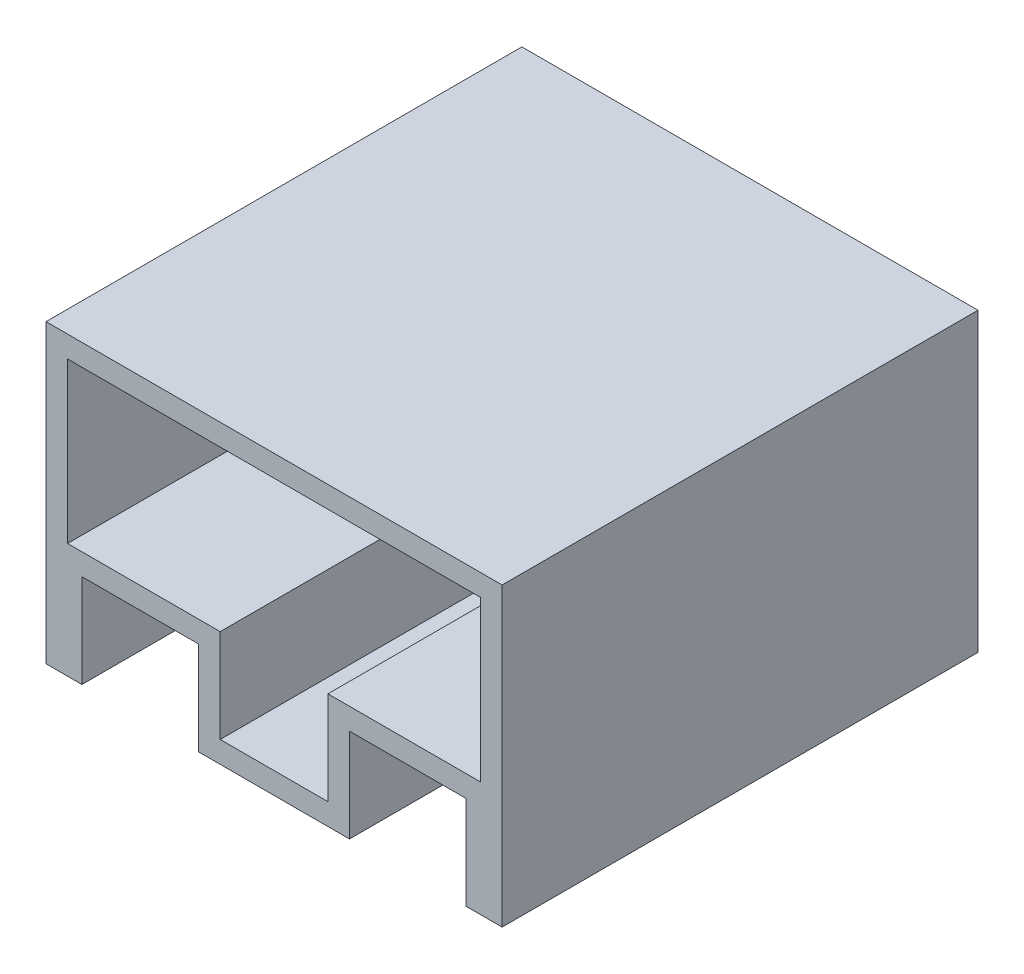
ISO-10303-21;
HEADER;
FILE_DESCRIPTION(('STEP AP214'),'2;1');
FILE_NAME('part.step','',(''),(''),'','','');
FILE_SCHEMA(('AUTOMOTIVE_DESIGN { 1 0 10303 214 1 1 1 1 }'));
ENDSEC;
DATA;
#1=APPLICATION_CONTEXT('core data for automotive mechanical design processes');
#2=APPLICATION_PROTOCOL_DEFINITION('international standard','automotive_design',2000,#1);
#3=PRODUCT_CONTEXT('',#1,'mechanical');
#4=PRODUCT('Part','Part','',(#3));
#5=PRODUCT_RELATED_PRODUCT_CATEGORY('part','',(#4));
#6=PRODUCT_DEFINITION_FORMATION('','',#4);
#7=PRODUCT_DEFINITION_CONTEXT('part definition',#1,'design');
#8=PRODUCT_DEFINITION('design','',#6,#7);
#9=PRODUCT_DEFINITION_SHAPE('','',#8);
#10=(LENGTH_UNIT() NAMED_UNIT(*) SI_UNIT(.MILLI.,.METRE.));
#11=(NAMED_UNIT(*) PLANE_ANGLE_UNIT() SI_UNIT($,.RADIAN.));
#12=(NAMED_UNIT(*) SI_UNIT($,.STERADIAN.) SOLID_ANGLE_UNIT());
#13=UNCERTAINTY_MEASURE_WITH_UNIT(LENGTH_MEASURE(1.E-05),#10,'distance_accuracy_value','');
#14=(GEOMETRIC_REPRESENTATION_CONTEXT(3) GLOBAL_UNCERTAINTY_ASSIGNED_CONTEXT((#13)) GLOBAL_UNIT_ASSIGNED_CONTEXT((#10,
#11,#12)) REPRESENTATION_CONTEXT('',''));
#15=CARTESIAN_POINT('',(0.,0.,0.));
#16=DIRECTION('',(0.,0.,1.));
#17=DIRECTION('',(1.,0.,0.));
#18=AXIS2_PLACEMENT_3D('',#15,#16,#17);
#19=CARTESIAN_POINT('',(15.7,-10.1,26.5));
#20=DIRECTION('',(0.,1.,0.));
#21=DIRECTION('',(0.,0.,1.));
#22=AXIS2_PLACEMENT_3D('',#19,#20,#21);
#23=PLANE('',#22);
#24=DIRECTION('',(0.,0.,-1.));
#25=VECTOR('',#24,1.);
#26=CARTESIAN_POINT('',(22.2,-10.1,26.5));
#27=LINE('',#26,#25);
#28=CARTESIAN_POINT('',(22.2,-10.1,26.5));
#29=VERTEX_POINT('',#28);
#30=CARTESIAN_POINT('',(22.2,-10.1,0.));
#31=VERTEX_POINT('',#30);
#32=EDGE_CURVE('E196',#29,#31,#27,.T.);
#33=ORIENTED_EDGE('',*,*,#32,.F.);
#34=DIRECTION('',(1.,0.,0.));
#35=VECTOR('',#34,1.);
#36=CARTESIAN_POINT('',(15.7,-10.1,26.5));
#37=LINE('',#36,#35);
#38=CARTESIAN_POINT('',(15.7,-10.1,26.5));
#39=VERTEX_POINT('',#38);
#40=EDGE_CURVE('E180',#39,#29,#37,.T.);
#41=ORIENTED_EDGE('',*,*,#40,.F.);
#42=DIRECTION('',(0.,0.,-1.));
#43=VECTOR('',#42,1.);
#44=CARTESIAN_POINT('',(15.7,-10.1,26.5));
#45=LINE('',#44,#43);
#46=CARTESIAN_POINT('',(15.7,-10.1,0.));
#47=VERTEX_POINT('',#46);
#48=EDGE_CURVE('E311',#39,#47,#45,.T.);
#49=ORIENTED_EDGE('',*,*,#48,.T.);
#50=DIRECTION('',(1.,0.,0.));
#51=VECTOR('',#50,1.);
#52=CARTESIAN_POINT('',(15.7,-10.1,0.));
#53=LINE('',#52,#51);
#54=EDGE_CURVE('E302',#47,#31,#53,.T.);
#55=ORIENTED_EDGE('',*,*,#54,.T.);
#56=EDGE_LOOP('',(#33,#41,#49,#55));
#57=FACE_BOUND('',#56,.T.);
#58=ADVANCED_FACE('F33',(#57),#23,.F.);
#59=CARTESIAN_POINT('',(-1.2,-10.1,26.5));
#60=DIRECTION('',(0.,1.,0.));
#61=DIRECTION('',(0.,0.,1.));
#62=AXIS2_PLACEMENT_3D('',#59,#60,#61);
#63=PLANE('',#62);
#64=DIRECTION('',(0.,0.,1.));
#65=VECTOR('',#64,1.);
#66=CARTESIAN_POINT('',(0.800000000000002,-10.1,26.5));
#67=LINE('',#66,#65);
#68=CARTESIAN_POINT('',(0.800000000000004,-10.1,0.));
#69=VERTEX_POINT('',#68);
#70=CARTESIAN_POINT('',(0.800000000000002,-10.1,26.5));
#71=VERTEX_POINT('',#70);
#72=EDGE_CURVE('E206',#69,#71,#67,.T.);
#73=ORIENTED_EDGE('',*,*,#72,.F.);
#74=DIRECTION('',(1.,0.,0.));
#75=VECTOR('',#74,1.);
#76=CARTESIAN_POINT('',(-1.2,-10.1,0.));
#77=LINE('',#76,#75);
#78=CARTESIAN_POINT('',(7.3,-10.1,0.));
#79=VERTEX_POINT('',#78);
#80=EDGE_CURVE('E294',#69,#79,#77,.T.);
#81=ORIENTED_EDGE('',*,*,#80,.T.);
#82=DIRECTION('',(0.,0.,-1.));
#83=VECTOR('',#82,1.);
#84=CARTESIAN_POINT('',(7.3,-10.1,26.5));
#85=LINE('',#84,#83);
#86=CARTESIAN_POINT('',(7.3,-10.1,26.5));
#87=VERTEX_POINT('',#86);
#88=EDGE_CURVE('E11',#87,#79,#85,.T.);
#89=ORIENTED_EDGE('',*,*,#88,.F.);
#90=DIRECTION('',(1.,0.,0.));
#91=VECTOR('',#90,1.);
#92=CARTESIAN_POINT('',(-1.2,-10.1,26.5));
#93=LINE('',#92,#91);
#94=EDGE_CURVE('E281',#71,#87,#93,.T.);
#95=ORIENTED_EDGE('',*,*,#94,.F.);
#96=EDGE_LOOP('',(#73,#81,#89,#95));
#97=FACE_BOUND('',#96,.T.);
#98=ADVANCED_FACE('F345',(#97),#63,.F.);
#99=CARTESIAN_POINT('',(0.,0.,26.5));
#100=DIRECTION('',(0.,0.,1.));
#101=DIRECTION('',(1.,0.,0.));
#102=AXIS2_PLACEMENT_3D('',#99,#100,#101);
#103=PLANE('',#102);
#104=DIRECTION('',(0.,-1.,0.));
#105=VECTOR('',#104,1.);
#106=CARTESIAN_POINT('',(-1.2,1.2,26.5));
#107=LINE('',#106,#105);
#108=CARTESIAN_POINT('',(-1.2,1.2,26.5));
#109=VERTEX_POINT('',#108);
#110=CARTESIAN_POINT('',(-1.2,-15.3,26.5));
#111=VERTEX_POINT('',#110);
#112=EDGE_CURVE('E279',#109,#111,#107,.T.);
#113=ORIENTED_EDGE('',*,*,#112,.T.);
#114=DIRECTION('',(-1.,0.,0.));
#115=VECTOR('',#114,1.);
#116=CARTESIAN_POINT('',(-1.2,-15.3,26.5));
#117=LINE('',#116,#115);
#118=CARTESIAN_POINT('',(0.800000000000002,-15.3,26.5));
#119=VERTEX_POINT('',#118);
#120=EDGE_CURVE('E214',#119,#111,#117,.T.);
#121=ORIENTED_EDGE('',*,*,#120,.F.);
#122=DIRECTION('',(0.,1.,0.));
#123=VECTOR('',#122,1.);
#124=CARTESIAN_POINT('',(0.800000000000002,-15.3,26.5));
#125=LINE('',#124,#123);
#126=EDGE_CURVE('E48',#119,#71,#125,.T.);
#127=ORIENTED_EDGE('',*,*,#126,.T.);
#128=ORIENTED_EDGE('',*,*,#94,.T.);
#129=DIRECTION('',(0.,-1.,0.));
#130=VECTOR('',#129,1.);
#131=CARTESIAN_POINT('',(7.3,-10.1,26.5));
#132=LINE('',#131,#130);
#133=CARTESIAN_POINT('',(7.3,-15.3,26.5));
#134=VERTEX_POINT('',#133);
#135=EDGE_CURVE('E284',#87,#134,#132,.T.);
#136=ORIENTED_EDGE('',*,*,#135,.T.);
#137=DIRECTION('',(1.,0.,0.));
#138=VECTOR('',#137,1.);
#139=CARTESIAN_POINT('',(7.3,-15.3,26.5));
#140=LINE('',#139,#138);
#141=CARTESIAN_POINT('',(15.7,-15.3,26.5));
#142=VERTEX_POINT('',#141);
#143=EDGE_CURVE('E286',#134,#142,#140,.T.);
#144=ORIENTED_EDGE('',*,*,#143,.T.);
#145=DIRECTION('',(0.,1.,0.));
#146=VECTOR('',#145,1.);
#147=CARTESIAN_POINT('',(15.7,-15.3,26.5));
#148=LINE('',#147,#146);
#149=EDGE_CURVE('E288',#142,#39,#148,.T.);
#150=ORIENTED_EDGE('',*,*,#149,.T.);
#151=ORIENTED_EDGE('',*,*,#40,.T.);
#152=DIRECTION('',(0.,1.,0.));
#153=VECTOR('',#152,1.);
#154=CARTESIAN_POINT('',(22.2,-15.3,26.5));
#155=LINE('',#154,#153);
#156=CARTESIAN_POINT('',(22.2,-15.3,26.5));
#157=VERTEX_POINT('',#156);
#158=EDGE_CURVE('E187',#157,#29,#155,.T.);
#159=ORIENTED_EDGE('',*,*,#158,.F.);
#160=DIRECTION('',(-1.,0.,0.));
#161=VECTOR('',#160,1.);
#162=CARTESIAN_POINT('',(24.2,-15.3,26.5));
#163=LINE('',#162,#161);
#164=CARTESIAN_POINT('',(24.2,-15.3,26.5));
#165=VERTEX_POINT('',#164);
#166=EDGE_CURVE('E183',#165,#157,#163,.T.);
#167=ORIENTED_EDGE('',*,*,#166,.F.);
#168=DIRECTION('',(0.,1.,0.));
#169=VECTOR('',#168,1.);
#170=CARTESIAN_POINT('',(24.2,1.2,26.5));
#171=LINE('',#170,#169);
#172=CARTESIAN_POINT('',(24.2,1.2,26.5));
#173=VERTEX_POINT('',#172);
#174=EDGE_CURVE('E171',#165,#173,#171,.T.);
#175=ORIENTED_EDGE('',*,*,#174,.T.);
#176=DIRECTION('',(-1.,0.,0.));
#177=VECTOR('',#176,1.);
#178=CARTESIAN_POINT('',(-1.2,1.2,26.5));
#179=LINE('',#178,#177);
#180=EDGE_CURVE('E179',#173,#109,#179,.T.);
#181=ORIENTED_EDGE('',*,*,#180,.T.);
#182=EDGE_LOOP('',(#113,#121,#127,#128,#136,#144,#150,#151,#159,#167,#175,#181));
#183=FACE_BOUND('',#182,.T.);
#184=DIRECTION('',(1.,0.,0.));
#185=VECTOR('',#184,1.);
#186=CARTESIAN_POINT('',(0.,-8.9,26.5));
#187=LINE('',#186,#185);
#188=CARTESIAN_POINT('',(0.,-8.9,26.5));
#189=VERTEX_POINT('',#188);
#190=CARTESIAN_POINT('',(8.5,-8.9,26.5));
#191=VERTEX_POINT('',#190);
#192=EDGE_CURVE('E224',#189,#191,#187,.T.);
#193=ORIENTED_EDGE('',*,*,#192,.F.);
#194=DIRECTION('',(0.,-1.,0.));
#195=VECTOR('',#194,1.);
#196=CARTESIAN_POINT('',(0.,0.,26.5));
#197=LINE('',#196,#195);
#198=CARTESIAN_POINT('',(0.,0.,26.5));
#199=VERTEX_POINT('',#198);
#200=EDGE_CURVE('E222',#199,#189,#197,.T.);
#201=ORIENTED_EDGE('',*,*,#200,.F.);
#202=DIRECTION('',(-1.,0.,0.));
#203=VECTOR('',#202,1.);
#204=CARTESIAN_POINT('',(0.,0.,26.5));
#205=LINE('',#204,#203);
#206=CARTESIAN_POINT('',(23.,0.,26.5));
#207=VERTEX_POINT('',#206);
#208=EDGE_CURVE('E237',#207,#199,#205,.T.);
#209=ORIENTED_EDGE('',*,*,#208,.F.);
#210=DIRECTION('',(0.,1.,0.));
#211=VECTOR('',#210,1.);
#212=CARTESIAN_POINT('',(23.,0.,26.5));
#213=LINE('',#212,#211);
#214=CARTESIAN_POINT('',(23.,-8.9,26.5));
#215=VERTEX_POINT('',#214);
#216=EDGE_CURVE('E235',#215,#207,#213,.T.);
#217=ORIENTED_EDGE('',*,*,#216,.F.);
#218=DIRECTION('',(1.,0.,0.));
#219=VECTOR('',#218,1.);
#220=CARTESIAN_POINT('',(14.5,-8.9,26.5));
#221=LINE('',#220,#219);
#222=CARTESIAN_POINT('',(14.5,-8.9,26.5));
#223=VERTEX_POINT('',#222);
#224=EDGE_CURVE('E233',#223,#215,#221,.T.);
#225=ORIENTED_EDGE('',*,*,#224,.F.);
#226=DIRECTION('',(0.,1.,0.));
#227=VECTOR('',#226,1.);
#228=CARTESIAN_POINT('',(14.5,-14.1,26.5));
#229=LINE('',#228,#227);
#230=CARTESIAN_POINT('',(14.5,-14.1,26.5));
#231=VERTEX_POINT('',#230);
#232=EDGE_CURVE('E231',#231,#223,#229,.T.);
#233=ORIENTED_EDGE('',*,*,#232,.F.);
#234=DIRECTION('',(1.,0.,0.));
#235=VECTOR('',#234,1.);
#236=CARTESIAN_POINT('',(8.5,-14.1,26.5));
#237=LINE('',#236,#235);
#238=CARTESIAN_POINT('',(8.5,-14.1,26.5));
#239=VERTEX_POINT('',#238);
#240=EDGE_CURVE('E229',#239,#231,#237,.T.);
#241=ORIENTED_EDGE('',*,*,#240,.F.);
#242=DIRECTION('',(0.,-1.,0.));
#243=VECTOR('',#242,1.);
#244=CARTESIAN_POINT('',(8.5,-8.9,26.5));
#245=LINE('',#244,#243);
#246=EDGE_CURVE('E227',#191,#239,#245,.T.);
#247=ORIENTED_EDGE('',*,*,#246,.F.);
#248=EDGE_LOOP('',(#193,#201,#209,#217,#225,#233,#241,#247));
#249=FACE_BOUND('',#248,.T.);
#250=ADVANCED_FACE('F184',(#183,#249),#103,.T.);
#251=CARTESIAN_POINT('',(0.,0.,0.));
#252=DIRECTION('',(0.,0.,1.));
#253=DIRECTION('',(1.,0.,0.));
#254=AXIS2_PLACEMENT_3D('',#251,#252,#253);
#255=PLANE('',#254);
#256=DIRECTION('',(0.,-1.,0.));
#257=VECTOR('',#256,1.);
#258=CARTESIAN_POINT('',(-1.2,1.2,0.));
#259=LINE('',#258,#257);
#260=CARTESIAN_POINT('',(-1.2,1.2,0.));
#261=VERTEX_POINT('',#260);
#262=CARTESIAN_POINT('',(-1.2,-15.3,0.));
#263=VERTEX_POINT('',#262);
#264=EDGE_CURVE('E278',#261,#263,#259,.T.);
#265=ORIENTED_EDGE('',*,*,#264,.F.);
#266=DIRECTION('',(-1.,0.,0.));
#267=VECTOR('',#266,1.);
#268=CARTESIAN_POINT('',(-1.2,1.2,0.));
#269=LINE('',#268,#267);
#270=CARTESIAN_POINT('',(24.2,1.2,0.));
#271=VERTEX_POINT('',#270);
#272=EDGE_CURVE('E282',#271,#261,#269,.T.);
#273=ORIENTED_EDGE('',*,*,#272,.F.);
#274=DIRECTION('',(0.,1.,0.));
#275=VECTOR('',#274,1.);
#276=CARTESIAN_POINT('',(24.2,1.2,0.));
#277=LINE('',#276,#275);
#278=CARTESIAN_POINT('',(24.2,-15.3,0.));
#279=VERTEX_POINT('',#278);
#280=EDGE_CURVE('E305',#279,#271,#277,.T.);
#281=ORIENTED_EDGE('',*,*,#280,.F.);
#282=DIRECTION('',(1.,0.,0.));
#283=VECTOR('',#282,1.);
#284=CARTESIAN_POINT('',(24.2,-15.3,0.));
#285=LINE('',#284,#283);
#286=CARTESIAN_POINT('',(22.2,-15.3,0.));
#287=VERTEX_POINT('',#286);
#288=EDGE_CURVE('E195',#287,#279,#285,.T.);
#289=ORIENTED_EDGE('',*,*,#288,.F.);
#290=DIRECTION('',(0.,1.,0.));
#291=VECTOR('',#290,1.);
#292=CARTESIAN_POINT('',(22.2,-15.3,0.));
#293=LINE('',#292,#291);
#294=EDGE_CURVE('E201',#287,#31,#293,.T.);
#295=ORIENTED_EDGE('',*,*,#294,.T.);
#296=ORIENTED_EDGE('',*,*,#54,.F.);
#297=DIRECTION('',(0.,1.,0.));
#298=VECTOR('',#297,1.);
#299=CARTESIAN_POINT('',(15.7,-15.3,0.));
#300=LINE('',#299,#298);
#301=CARTESIAN_POINT('',(15.7,-15.3,0.));
#302=VERTEX_POINT('',#301);
#303=EDGE_CURVE('E300',#302,#47,#300,.T.);
#304=ORIENTED_EDGE('',*,*,#303,.F.);
#305=DIRECTION('',(1.,0.,0.));
#306=VECTOR('',#305,1.);
#307=CARTESIAN_POINT('',(7.3,-15.3,0.));
#308=LINE('',#307,#306);
#309=CARTESIAN_POINT('',(7.3,-15.3,0.));
#310=VERTEX_POINT('',#309);
#311=EDGE_CURVE('E298',#310,#302,#308,.T.);
#312=ORIENTED_EDGE('',*,*,#311,.F.);
#313=DIRECTION('',(0.,-1.,0.));
#314=VECTOR('',#313,1.);
#315=CARTESIAN_POINT('',(7.3,-10.1,0.));
#316=LINE('',#315,#314);
#317=EDGE_CURVE('E296',#79,#310,#316,.T.);
#318=ORIENTED_EDGE('',*,*,#317,.F.);
#319=ORIENTED_EDGE('',*,*,#80,.F.);
#320=DIRECTION('',(0.,1.,0.));
#321=VECTOR('',#320,1.);
#322=CARTESIAN_POINT('',(0.800000000000004,-15.3,0.));
#323=LINE('',#322,#321);
#324=CARTESIAN_POINT('',(0.800000000000004,-15.3,0.));
#325=VERTEX_POINT('',#324);
#326=EDGE_CURVE('E219',#325,#69,#323,.T.);
#327=ORIENTED_EDGE('',*,*,#326,.F.);
#328=DIRECTION('',(1.,0.,0.));
#329=VECTOR('',#328,1.);
#330=CARTESIAN_POINT('',(-1.2,-15.3,0.));
#331=LINE('',#330,#329);
#332=EDGE_CURVE('E210',#263,#325,#331,.T.);
#333=ORIENTED_EDGE('',*,*,#332,.F.);
#334=EDGE_LOOP('',(#265,#273,#281,#289,#295,#296,#304,#312,#318,#319,#327,#333));
#335=FACE_BOUND('',#334,.T.);
#336=DIRECTION('',(0.,-1.,0.));
#337=VECTOR('',#336,1.);
#338=CARTESIAN_POINT('',(0.,0.,0.));
#339=LINE('',#338,#337);
#340=CARTESIAN_POINT('',(0.,0.,0.));
#341=VERTEX_POINT('',#340);
#342=CARTESIAN_POINT('',(0.,-8.9,0.));
#343=VERTEX_POINT('',#342);
#344=EDGE_CURVE('E221',#341,#343,#339,.T.);
#345=ORIENTED_EDGE('',*,*,#344,.T.);
#346=DIRECTION('',(1.,0.,0.));
#347=VECTOR('',#346,1.);
#348=CARTESIAN_POINT('',(0.,-8.9,0.));
#349=LINE('',#348,#347);
#350=CARTESIAN_POINT('',(8.5,-8.9,0.));
#351=VERTEX_POINT('',#350);
#352=EDGE_CURVE('E242',#343,#351,#349,.T.);
#353=ORIENTED_EDGE('',*,*,#352,.T.);
#354=DIRECTION('',(0.,-1.,0.));
#355=VECTOR('',#354,1.);
#356=CARTESIAN_POINT('',(8.5,-8.9,0.));
#357=LINE('',#356,#355);
#358=CARTESIAN_POINT('',(8.5,-14.1,0.));
#359=VERTEX_POINT('',#358);
#360=EDGE_CURVE('E245',#351,#359,#357,.T.);
#361=ORIENTED_EDGE('',*,*,#360,.T.);
#362=DIRECTION('',(1.,0.,0.));
#363=VECTOR('',#362,1.);
#364=CARTESIAN_POINT('',(8.5,-14.1,0.));
#365=LINE('',#364,#363);
#366=CARTESIAN_POINT('',(14.5,-14.1,0.));
#367=VERTEX_POINT('',#366);
#368=EDGE_CURVE('E248',#359,#367,#365,.T.);
#369=ORIENTED_EDGE('',*,*,#368,.T.);
#370=DIRECTION('',(0.,1.,0.));
#371=VECTOR('',#370,1.);
#372=CARTESIAN_POINT('',(14.5,-14.1,0.));
#373=LINE('',#372,#371);
#374=CARTESIAN_POINT('',(14.5,-8.9,0.));
#375=VERTEX_POINT('',#374);
#376=EDGE_CURVE('E251',#367,#375,#373,.T.);
#377=ORIENTED_EDGE('',*,*,#376,.T.);
#378=DIRECTION('',(1.,0.,0.));
#379=VECTOR('',#378,1.);
#380=CARTESIAN_POINT('',(14.5,-8.9,0.));
#381=LINE('',#380,#379);
#382=CARTESIAN_POINT('',(23.,-8.9,0.));
#383=VERTEX_POINT('',#382);
#384=EDGE_CURVE('E254',#375,#383,#381,.T.);
#385=ORIENTED_EDGE('',*,*,#384,.T.);
#386=DIRECTION('',(0.,1.,0.));
#387=VECTOR('',#386,1.);
#388=CARTESIAN_POINT('',(23.,0.,0.));
#389=LINE('',#388,#387);
#390=CARTESIAN_POINT('',(23.,0.,0.));
#391=VERTEX_POINT('',#390);
#392=EDGE_CURVE('E257',#383,#391,#389,.T.);
#393=ORIENTED_EDGE('',*,*,#392,.T.);
#394=DIRECTION('',(-1.,0.,0.));
#395=VECTOR('',#394,1.);
#396=CARTESIAN_POINT('',(0.,0.,0.));
#397=LINE('',#396,#395);
#398=EDGE_CURVE('E225',#391,#341,#397,.T.);
#399=ORIENTED_EDGE('',*,*,#398,.T.);
#400=EDGE_LOOP('',(#345,#353,#361,#369,#377,#385,#393,#399));
#401=FACE_BOUND('',#400,.T.);
#402=ADVANCED_FACE('F329',(#335,#401),#255,.F.);
#403=CARTESIAN_POINT('',(-1.2,1.2,26.5));
#404=DIRECTION('',(1.,0.,0.));
#405=DIRECTION('',(0.,1.,0.));
#406=AXIS2_PLACEMENT_3D('',#403,#404,#405);
#407=PLANE('',#406);
#408=ORIENTED_EDGE('',*,*,#264,.T.);
#409=DIRECTION('',(0.,0.,-1.));
#410=VECTOR('',#409,1.);
#411=CARTESIAN_POINT('',(-1.2,-15.3,26.5));
#412=LINE('',#411,#410);
#413=EDGE_CURVE('E207',#111,#263,#412,.T.);
#414=ORIENTED_EDGE('',*,*,#413,.F.);
#415=ORIENTED_EDGE('',*,*,#112,.F.);
#416=DIRECTION('',(0.,0.,-1.));
#417=VECTOR('',#416,1.);
#418=CARTESIAN_POINT('',(-1.2,1.2,26.5));
#419=LINE('',#418,#417);
#420=EDGE_CURVE('E292',#109,#261,#419,.T.);
#421=ORIENTED_EDGE('',*,*,#420,.T.);
#422=EDGE_LOOP('',(#408,#414,#415,#421));
#423=FACE_BOUND('',#422,.T.);
#424=ADVANCED_FACE('F35',(#423),#407,.F.);
#425=CARTESIAN_POINT('',(7.3,-10.1,26.5));
#426=DIRECTION('',(1.,0.,0.));
#427=DIRECTION('',(0.,0.,-1.));
#428=AXIS2_PLACEMENT_3D('',#425,#426,#427);
#429=PLANE('',#428);
#430=ORIENTED_EDGE('',*,*,#317,.T.);
#431=DIRECTION('',(0.,0.,-1.));
#432=VECTOR('',#431,1.);
#433=CARTESIAN_POINT('',(7.3,-15.3,26.5));
#434=LINE('',#433,#432);
#435=EDGE_CURVE('E41',#134,#310,#434,.T.);
#436=ORIENTED_EDGE('',*,*,#435,.F.);
#437=ORIENTED_EDGE('',*,*,#135,.F.);
#438=ORIENTED_EDGE('',*,*,#88,.T.);
#439=EDGE_LOOP('',(#430,#436,#437,#438));
#440=FACE_BOUND('',#439,.T.);
#441=ADVANCED_FACE('F342',(#440),#429,.F.);
#442=CARTESIAN_POINT('',(7.3,-15.3,26.5));
#443=DIRECTION('',(0.,1.,0.));
#444=DIRECTION('',(0.,0.,1.));
#445=AXIS2_PLACEMENT_3D('',#442,#443,#444);
#446=PLANE('',#445);
#447=ORIENTED_EDGE('',*,*,#311,.T.);
#448=DIRECTION('',(0.,0.,-1.));
#449=VECTOR('',#448,1.);
#450=CARTESIAN_POINT('',(15.7,-15.3,26.5));
#451=LINE('',#450,#449);
#452=EDGE_CURVE('E314',#142,#302,#451,.T.);
#453=ORIENTED_EDGE('',*,*,#452,.F.);
#454=ORIENTED_EDGE('',*,*,#143,.F.);
#455=ORIENTED_EDGE('',*,*,#435,.T.);
#456=EDGE_LOOP('',(#447,#453,#454,#455));
#457=FACE_BOUND('',#456,.T.);
#458=ADVANCED_FACE('F321',(#457),#446,.F.);
#459=CARTESIAN_POINT('',(15.7,-15.3,26.5));
#460=DIRECTION('',(-1.,0.,0.));
#461=DIRECTION('',(0.,0.,1.));
#462=AXIS2_PLACEMENT_3D('',#459,#460,#461);
#463=PLANE('',#462);
#464=ORIENTED_EDGE('',*,*,#303,.T.);
#465=ORIENTED_EDGE('',*,*,#48,.F.);
#466=ORIENTED_EDGE('',*,*,#149,.F.);
#467=ORIENTED_EDGE('',*,*,#452,.T.);
#468=EDGE_LOOP('',(#464,#465,#466,#467));
#469=FACE_BOUND('',#468,.T.);
#470=ADVANCED_FACE('F335',(#469),#463,.F.);
#471=CARTESIAN_POINT('',(24.2,1.2,26.5));
#472=DIRECTION('',(-1.,0.,0.));
#473=DIRECTION('',(0.,0.,1.));
#474=AXIS2_PLACEMENT_3D('',#471,#472,#473);
#475=PLANE('',#474);
#476=ORIENTED_EDGE('',*,*,#280,.T.);
#477=DIRECTION('',(0.,0.,-1.));
#478=VECTOR('',#477,1.);
#479=CARTESIAN_POINT('',(24.2,1.2,26.5));
#480=LINE('',#479,#478);
#481=EDGE_CURVE('E177',#173,#271,#480,.T.);
#482=ORIENTED_EDGE('',*,*,#481,.F.);
#483=ORIENTED_EDGE('',*,*,#174,.F.);
#484=DIRECTION('',(0.,0.,1.));
#485=VECTOR('',#484,1.);
#486=CARTESIAN_POINT('',(24.2,-15.3,26.5));
#487=LINE('',#486,#485);
#488=EDGE_CURVE('E175',#279,#165,#487,.T.);
#489=ORIENTED_EDGE('',*,*,#488,.F.);
#490=EDGE_LOOP('',(#476,#482,#483,#489));
#491=FACE_BOUND('',#490,.T.);
#492=ADVANCED_FACE('F173',(#491),#475,.F.);
#493=CARTESIAN_POINT('',(-1.2,1.2,26.5));
#494=DIRECTION('',(0.,-1.,0.));
#495=DIRECTION('',(0.,0.,-1.));
#496=AXIS2_PLACEMENT_3D('',#493,#494,#495);
#497=PLANE('',#496);
#498=ORIENTED_EDGE('',*,*,#272,.T.);
#499=ORIENTED_EDGE('',*,*,#420,.F.);
#500=ORIENTED_EDGE('',*,*,#180,.F.);
#501=ORIENTED_EDGE('',*,*,#481,.T.);
#502=EDGE_LOOP('',(#498,#499,#500,#501));
#503=FACE_BOUND('',#502,.T.);
#504=ADVANCED_FACE('F359',(#503),#497,.F.);
#505=CARTESIAN_POINT('',(0.,0.,26.5));
#506=DIRECTION('',(1.,0.,0.));
#507=DIRECTION('',(0.,1.,0.));
#508=AXIS2_PLACEMENT_3D('',#505,#506,#507);
#509=PLANE('',#508);
#510=ORIENTED_EDGE('',*,*,#344,.F.);
#511=DIRECTION('',(0.,0.,-1.));
#512=VECTOR('',#511,1.);
#513=CARTESIAN_POINT('',(0.,0.,26.5));
#514=LINE('',#513,#512);
#515=EDGE_CURVE('E239',#199,#341,#514,.T.);
#516=ORIENTED_EDGE('',*,*,#515,.F.);
#517=ORIENTED_EDGE('',*,*,#200,.T.);
#518=DIRECTION('',(0.,0.,-1.));
#519=VECTOR('',#518,1.);
#520=CARTESIAN_POINT('',(0.,-8.9,26.5));
#521=LINE('',#520,#519);
#522=EDGE_CURVE('E275',#189,#343,#521,.T.);
#523=ORIENTED_EDGE('',*,*,#522,.T.);
#524=EDGE_LOOP('',(#510,#516,#517,#523));
#525=FACE_BOUND('',#524,.T.);
#526=ADVANCED_FACE('F361',(#525),#509,.T.);
#527=CARTESIAN_POINT('',(0.,-8.9,26.5));
#528=DIRECTION('',(0.,1.,0.));
#529=DIRECTION('',(0.,0.,1.));
#530=AXIS2_PLACEMENT_3D('',#527,#528,#529);
#531=PLANE('',#530);
#532=ORIENTED_EDGE('',*,*,#352,.F.);
#533=ORIENTED_EDGE('',*,*,#522,.F.);
#534=ORIENTED_EDGE('',*,*,#192,.T.);
#535=DIRECTION('',(0.,0.,-1.));
#536=VECTOR('',#535,1.);
#537=CARTESIAN_POINT('',(8.5,-8.9,26.5));
#538=LINE('',#537,#536);
#539=EDGE_CURVE('E273',#191,#351,#538,.T.);
#540=ORIENTED_EDGE('',*,*,#539,.T.);
#541=EDGE_LOOP('',(#532,#533,#534,#540));
#542=FACE_BOUND('',#541,.T.);
#543=ADVANCED_FACE('F367',(#542),#531,.T.);
#544=CARTESIAN_POINT('',(8.5,-8.9,26.5));
#545=DIRECTION('',(1.,0.,0.));
#546=DIRECTION('',(0.,1.,0.));
#547=AXIS2_PLACEMENT_3D('',#544,#545,#546);
#548=PLANE('',#547);
#549=ORIENTED_EDGE('',*,*,#360,.F.);
#550=ORIENTED_EDGE('',*,*,#539,.F.);
#551=ORIENTED_EDGE('',*,*,#246,.T.);
#552=DIRECTION('',(0.,0.,-1.));
#553=VECTOR('',#552,1.);
#554=CARTESIAN_POINT('',(8.5,-14.1,26.5));
#555=LINE('',#554,#553);
#556=EDGE_CURVE('E271',#239,#359,#555,.T.);
#557=ORIENTED_EDGE('',*,*,#556,.T.);
#558=EDGE_LOOP('',(#549,#550,#551,#557));
#559=FACE_BOUND('',#558,.T.);
#560=ADVANCED_FACE('F396',(#559),#548,.T.);
#561=CARTESIAN_POINT('',(8.5,-14.1,26.5));
#562=DIRECTION('',(0.,1.,0.));
#563=DIRECTION('',(0.,0.,1.));
#564=AXIS2_PLACEMENT_3D('',#561,#562,#563);
#565=PLANE('',#564);
#566=ORIENTED_EDGE('',*,*,#368,.F.);
#567=ORIENTED_EDGE('',*,*,#556,.F.);
#568=ORIENTED_EDGE('',*,*,#240,.T.);
#569=DIRECTION('',(0.,0.,-1.));
#570=VECTOR('',#569,1.);
#571=CARTESIAN_POINT('',(14.5,-14.1,26.5));
#572=LINE('',#571,#570);
#573=EDGE_CURVE('E269',#231,#367,#572,.T.);
#574=ORIENTED_EDGE('',*,*,#573,.T.);
#575=EDGE_LOOP('',(#566,#567,#568,#574));
#576=FACE_BOUND('',#575,.T.);
#577=ADVANCED_FACE('F400',(#576),#565,.T.);
#578=CARTESIAN_POINT('',(14.5,-14.1,26.5));
#579=DIRECTION('',(-1.,0.,0.));
#580=DIRECTION('',(0.,0.,1.));
#581=AXIS2_PLACEMENT_3D('',#578,#579,#580);
#582=PLANE('',#581);
#583=ORIENTED_EDGE('',*,*,#376,.F.);
#584=ORIENTED_EDGE('',*,*,#573,.F.);
#585=ORIENTED_EDGE('',*,*,#232,.T.);
#586=DIRECTION('',(0.,0.,-1.));
#587=VECTOR('',#586,1.);
#588=CARTESIAN_POINT('',(14.5,-8.9,26.5));
#589=LINE('',#588,#587);
#590=EDGE_CURVE('E267',#223,#375,#589,.T.);
#591=ORIENTED_EDGE('',*,*,#590,.T.);
#592=EDGE_LOOP('',(#583,#584,#585,#591));
#593=FACE_BOUND('',#592,.T.);
#594=ADVANCED_FACE('F404',(#593),#582,.T.);
#595=CARTESIAN_POINT('',(14.5,-8.9,26.5));
#596=DIRECTION('',(0.,1.,0.));
#597=DIRECTION('',(-1.,0.,0.));
#598=AXIS2_PLACEMENT_3D('',#595,#596,#597);
#599=PLANE('',#598);
#600=ORIENTED_EDGE('',*,*,#384,.F.);
#601=ORIENTED_EDGE('',*,*,#590,.F.);
#602=ORIENTED_EDGE('',*,*,#224,.T.);
#603=DIRECTION('',(0.,0.,-1.));
#604=VECTOR('',#603,1.);
#605=CARTESIAN_POINT('',(23.,-8.9,26.5));
#606=LINE('',#605,#604);
#607=EDGE_CURVE('E265',#215,#383,#606,.T.);
#608=ORIENTED_EDGE('',*,*,#607,.T.);
#609=EDGE_LOOP('',(#600,#601,#602,#608));
#610=FACE_BOUND('',#609,.T.);
#611=ADVANCED_FACE('F408',(#610),#599,.T.);
#612=CARTESIAN_POINT('',(23.,0.,26.5));
#613=DIRECTION('',(-1.,0.,0.));
#614=DIRECTION('',(0.,-1.,0.));
#615=AXIS2_PLACEMENT_3D('',#612,#613,#614);
#616=PLANE('',#615);
#617=ORIENTED_EDGE('',*,*,#392,.F.);
#618=ORIENTED_EDGE('',*,*,#607,.F.);
#619=ORIENTED_EDGE('',*,*,#216,.T.);
#620=DIRECTION('',(0.,0.,-1.));
#621=VECTOR('',#620,1.);
#622=CARTESIAN_POINT('',(23.,0.,26.5));
#623=LINE('',#622,#621);
#624=EDGE_CURVE('E56',#207,#391,#623,.T.);
#625=ORIENTED_EDGE('',*,*,#624,.T.);
#626=EDGE_LOOP('',(#617,#618,#619,#625));
#627=FACE_BOUND('',#626,.T.);
#628=ADVANCED_FACE('F412',(#627),#616,.T.);
#629=CARTESIAN_POINT('',(0.,0.,26.5));
#630=DIRECTION('',(0.,-1.,0.));
#631=DIRECTION('',(1.,0.,0.));
#632=AXIS2_PLACEMENT_3D('',#629,#630,#631);
#633=PLANE('',#632);
#634=ORIENTED_EDGE('',*,*,#398,.F.);
#635=ORIENTED_EDGE('',*,*,#624,.F.);
#636=ORIENTED_EDGE('',*,*,#208,.T.);
#637=ORIENTED_EDGE('',*,*,#515,.T.);
#638=EDGE_LOOP('',(#634,#635,#636,#637));
#639=FACE_BOUND('',#638,.T.);
#640=ADVANCED_FACE('F416',(#639),#633,.T.);
#641=CARTESIAN_POINT('',(0.800000000000002,-15.3,26.5));
#642=DIRECTION('',(-1.,0.,0.));
#643=DIRECTION('',(0.,0.,1.));
#644=AXIS2_PLACEMENT_3D('',#641,#642,#643);
#645=PLANE('',#644);
#646=ORIENTED_EDGE('',*,*,#72,.T.);
#647=ORIENTED_EDGE('',*,*,#126,.F.);
#648=DIRECTION('',(0.,0.,1.));
#649=VECTOR('',#648,1.);
#650=CARTESIAN_POINT('',(0.800000000000002,-15.3,26.5));
#651=LINE('',#650,#649);
#652=EDGE_CURVE('E212',#325,#119,#651,.T.);
#653=ORIENTED_EDGE('',*,*,#652,.F.);
#654=ORIENTED_EDGE('',*,*,#326,.T.);
#655=EDGE_LOOP('',(#646,#647,#653,#654));
#656=FACE_BOUND('',#655,.T.);
#657=ADVANCED_FACE('F350',(#656),#645,.F.);
#658=CARTESIAN_POINT('',(0.,-15.3,0.));
#659=DIRECTION('',(0.,-1.,0.));
#660=DIRECTION('',(0.,0.,-1.));
#661=AXIS2_PLACEMENT_3D('',#658,#659,#660);
#662=PLANE('',#661);
#663=ORIENTED_EDGE('',*,*,#413,.T.);
#664=ORIENTED_EDGE('',*,*,#332,.T.);
#665=ORIENTED_EDGE('',*,*,#652,.T.);
#666=ORIENTED_EDGE('',*,*,#120,.T.);
#667=EDGE_LOOP('',(#663,#664,#665,#666));
#668=FACE_BOUND('',#667,.T.);
#669=ADVANCED_FACE('F352',(#668),#662,.T.);
#670=CARTESIAN_POINT('',(22.2,-15.3,26.5));
#671=DIRECTION('',(1.,0.,0.));
#672=DIRECTION('',(0.,0.,-1.));
#673=AXIS2_PLACEMENT_3D('',#670,#671,#672);
#674=PLANE('',#673);
#675=ORIENTED_EDGE('',*,*,#32,.T.);
#676=ORIENTED_EDGE('',*,*,#294,.F.);
#677=DIRECTION('',(0.,0.,-1.));
#678=VECTOR('',#677,1.);
#679=CARTESIAN_POINT('',(22.2,-15.3,26.5));
#680=LINE('',#679,#678);
#681=EDGE_CURVE('E190',#157,#287,#680,.T.);
#682=ORIENTED_EDGE('',*,*,#681,.F.);
#683=ORIENTED_EDGE('',*,*,#158,.T.);
#684=EDGE_LOOP('',(#675,#676,#682,#683));
#685=FACE_BOUND('',#684,.T.);
#686=ADVANCED_FACE('F424',(#685),#674,.F.);
#687=CARTESIAN_POINT('',(0.,-15.3,0.));
#688=DIRECTION('',(0.,1.,0.));
#689=DIRECTION('',(0.,0.,1.));
#690=AXIS2_PLACEMENT_3D('',#687,#688,#689);
#691=PLANE('',#690);
#692=ORIENTED_EDGE('',*,*,#488,.T.);
#693=ORIENTED_EDGE('',*,*,#166,.T.);
#694=ORIENTED_EDGE('',*,*,#681,.T.);
#695=ORIENTED_EDGE('',*,*,#288,.T.);
#696=EDGE_LOOP('',(#692,#693,#694,#695));
#697=FACE_BOUND('',#696,.T.);
#698=ADVANCED_FACE('F193',(#697),#691,.F.);
#699=CLOSED_SHELL('',(#58,#98,#250,#402,#424,#441,#458,#470,#492,#504,#526,#543,#560,#577,#594,
#611,#628,#640,#657,#669,#686,#698));
#700=MANIFOLD_SOLID_BREP('B2',#699);
#701=ADVANCED_BREP_SHAPE_REPRESENTATION('',(#18,#700),#14);
#702=SHAPE_DEFINITION_REPRESENTATION(#9,#701);
ENDSEC;
END-ISO-10303-21;
